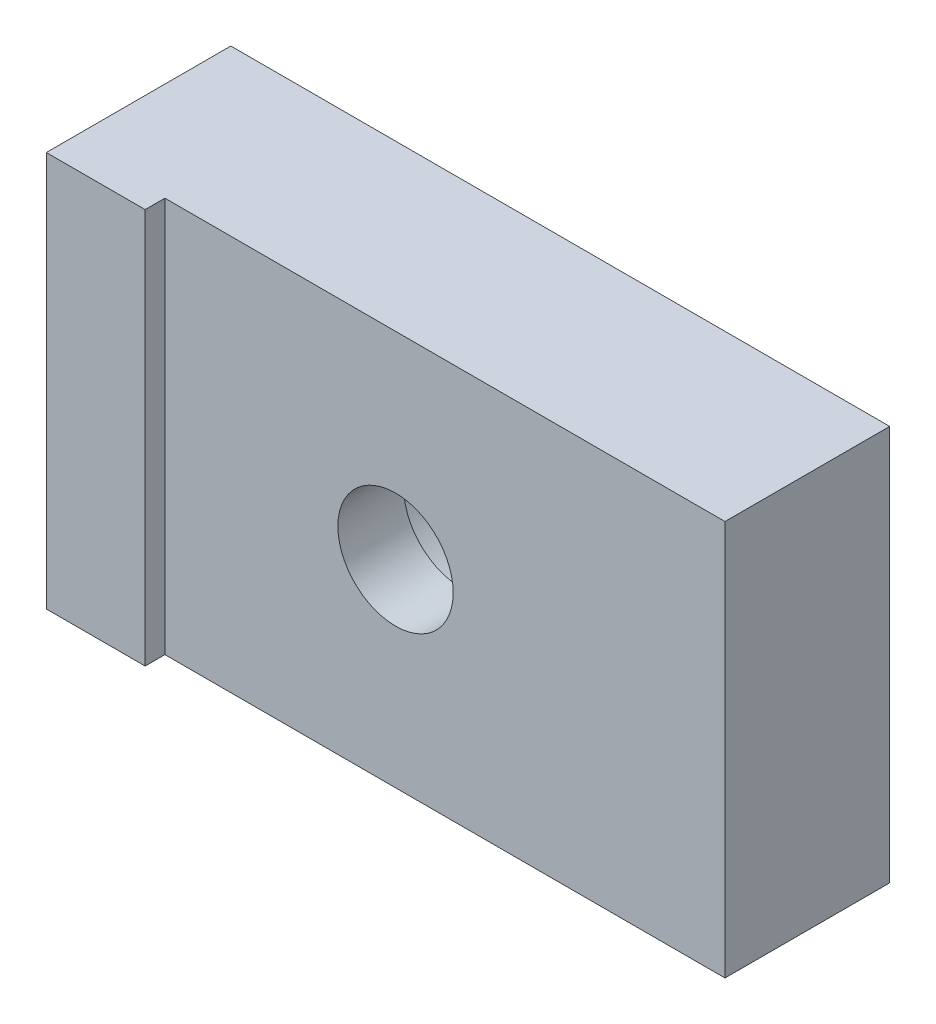
ISO-10303-21;
HEADER;
FILE_DESCRIPTION(('STEP AP214'),'2;1');
FILE_NAME('part.step','',(''),(''),'','','');
FILE_SCHEMA(('AUTOMOTIVE_DESIGN { 1 0 10303 214 1 1 1 1 }'));
ENDSEC;
DATA;
#1=APPLICATION_CONTEXT('core data for automotive mechanical design processes');
#2=APPLICATION_PROTOCOL_DEFINITION('international standard','automotive_design',2000,#1);
#3=PRODUCT_CONTEXT('',#1,'mechanical');
#4=PRODUCT('Part','Part','',(#3));
#5=PRODUCT_RELATED_PRODUCT_CATEGORY('part','',(#4));
#6=PRODUCT_DEFINITION_FORMATION('','',#4);
#7=PRODUCT_DEFINITION_CONTEXT('part definition',#1,'design');
#8=PRODUCT_DEFINITION('design','',#6,#7);
#9=PRODUCT_DEFINITION_SHAPE('','',#8);
#10=(LENGTH_UNIT() NAMED_UNIT(*) SI_UNIT(.MILLI.,.METRE.));
#11=(NAMED_UNIT(*) PLANE_ANGLE_UNIT() SI_UNIT($,.RADIAN.));
#12=(NAMED_UNIT(*) SI_UNIT($,.STERADIAN.) SOLID_ANGLE_UNIT());
#13=UNCERTAINTY_MEASURE_WITH_UNIT(LENGTH_MEASURE(1.E-05),#10,'distance_accuracy_value','');
#14=(GEOMETRIC_REPRESENTATION_CONTEXT(3) GLOBAL_UNCERTAINTY_ASSIGNED_CONTEXT((#13)) GLOBAL_UNIT_ASSIGNED_CONTEXT((#10,
#11,#12)) REPRESENTATION_CONTEXT('',''));
#15=CARTESIAN_POINT('',(0.,0.,0.));
#16=DIRECTION('',(0.,0.,1.));
#17=DIRECTION('',(1.,0.,0.));
#18=AXIS2_PLACEMENT_3D('',#15,#16,#17);
#19=CARTESIAN_POINT('',(10.,6.,5.));
#20=DIRECTION('',(0.,0.,-1.));
#21=DIRECTION('',(-1.,0.,0.));
#22=AXIS2_PLACEMENT_3D('',#19,#20,#21);
#23=CYLINDRICAL_SURFACE('',#22,1.75);
#24=CARTESIAN_POINT('',(10.,6.,5.));
#25=DIRECTION('',(0.,0.,1.));
#26=DIRECTION('',(1.,0.,0.));
#27=AXIS2_PLACEMENT_3D('',#24,#25,#26);
#28=CIRCLE('',#27,1.75);
#29=CARTESIAN_POINT('',(11.75,6.,5.));
#30=VERTEX_POINT('',#29);
#31=EDGE_CURVE('E100',#30,#30,#28,.T.);
#32=ORIENTED_EDGE('',*,*,#31,.T.);
#33=EDGE_LOOP('',(#32));
#34=FACE_BOUND('',#33,.T.);
#35=CARTESIAN_POINT('',(10.,6.,3.));
#36=DIRECTION('',(0.,0.,-1.));
#37=DIRECTION('',(-1.,0.,0.));
#38=AXIS2_PLACEMENT_3D('',#35,#36,#37);
#39=CIRCLE('',#38,1.75);
#40=CARTESIAN_POINT('',(8.25,6.,3.));
#41=VERTEX_POINT('',#40);
#42=EDGE_CURVE('E37',#41,#41,#39,.T.);
#43=ORIENTED_EDGE('',*,*,#42,.T.);
#44=EDGE_LOOP('',(#43));
#45=FACE_BOUND('',#44,.T.);
#46=ADVANCED_FACE('F33',(#34,#45),#23,.F.);
#47=CARTESIAN_POINT('',(0.,0.,5.));
#48=DIRECTION('',(0.,0.,-1.));
#49=DIRECTION('',(-1.,0.,0.));
#50=AXIS2_PLACEMENT_3D('',#47,#48,#49);
#51=PLANE('',#50);
#52=ORIENTED_EDGE('',*,*,#31,.F.);
#53=EDGE_LOOP('',(#52));
#54=FACE_BOUND('',#53,.T.);
#55=DIRECTION('',(0.,1.,0.));
#56=VECTOR('',#55,1.);
#57=CARTESIAN_POINT('',(3.,12.,5.));
#58=LINE('',#57,#56);
#59=CARTESIAN_POINT('',(3.,0.,5.));
#60=VERTEX_POINT('',#59);
#61=CARTESIAN_POINT('',(3.,12.,5.));
#62=VERTEX_POINT('',#61);
#63=EDGE_CURVE('E49',#60,#62,#58,.T.);
#64=ORIENTED_EDGE('',*,*,#63,.F.);
#65=DIRECTION('',(1.,0.,0.));
#66=VECTOR('',#65,1.);
#67=CARTESIAN_POINT('',(0.,0.,5.));
#68=LINE('',#67,#66);
#69=CARTESIAN_POINT('',(20.,0.,5.));
#70=VERTEX_POINT('',#69);
#71=EDGE_CURVE('E86',#60,#70,#68,.T.);
#72=ORIENTED_EDGE('',*,*,#71,.T.);
#73=DIRECTION('',(0.,1.,0.));
#74=VECTOR('',#73,1.);
#75=CARTESIAN_POINT('',(20.,0.,5.));
#76=LINE('',#75,#74);
#77=CARTESIAN_POINT('',(20.,12.,5.));
#78=VERTEX_POINT('',#77);
#79=EDGE_CURVE('E55',#70,#78,#76,.T.);
#80=ORIENTED_EDGE('',*,*,#79,.T.);
#81=DIRECTION('',(-1.,0.,0.));
#82=VECTOR('',#81,1.);
#83=CARTESIAN_POINT('',(0.,12.,5.));
#84=LINE('',#83,#82);
#85=EDGE_CURVE('E96',#78,#62,#84,.T.);
#86=ORIENTED_EDGE('',*,*,#85,.T.);
#87=EDGE_LOOP('',(#64,#72,#80,#86));
#88=FACE_BOUND('',#87,.T.);
#89=ADVANCED_FACE('F148',(#54,#88),#51,.F.);
#90=CARTESIAN_POINT('',(0.,0.,0.));
#91=DIRECTION('',(0.,0.,-1.));
#92=DIRECTION('',(-1.,0.,0.));
#93=AXIS2_PLACEMENT_3D('',#90,#91,#92);
#94=PLANE('',#93);
#95=CARTESIAN_POINT('',(10.,6.,0.));
#96=DIRECTION('',(0.,0.,-1.));
#97=DIRECTION('',(-1.,0.,0.));
#98=AXIS2_PLACEMENT_3D('',#95,#96,#97);
#99=CIRCLE('',#98,3.);
#100=CARTESIAN_POINT('',(7.,6.,0.));
#101=VERTEX_POINT('',#100);
#102=EDGE_CURVE('E258',#101,#101,#99,.T.);
#103=ORIENTED_EDGE('',*,*,#102,.F.);
#104=EDGE_LOOP('',(#103));
#105=FACE_BOUND('',#104,.T.);
#106=DIRECTION('',(0.,-1.,0.));
#107=VECTOR('',#106,1.);
#108=CARTESIAN_POINT('',(0.,0.,0.));
#109=LINE('',#108,#107);
#110=CARTESIAN_POINT('',(0.,12.,0.));
#111=VERTEX_POINT('',#110);
#112=CARTESIAN_POINT('',(0.,0.,0.));
#113=VERTEX_POINT('',#112);
#114=EDGE_CURVE('E93',#111,#113,#109,.T.);
#115=ORIENTED_EDGE('',*,*,#114,.F.);
#116=DIRECTION('',(-1.,0.,0.));
#117=VECTOR('',#116,1.);
#118=CARTESIAN_POINT('',(0.,12.,0.));
#119=LINE('',#118,#117);
#120=CARTESIAN_POINT('',(20.,12.,0.));
#121=VERTEX_POINT('',#120);
#122=EDGE_CURVE('E75',#121,#111,#119,.T.);
#123=ORIENTED_EDGE('',*,*,#122,.F.);
#124=DIRECTION('',(0.,1.,0.));
#125=VECTOR('',#124,1.);
#126=CARTESIAN_POINT('',(20.,0.,0.));
#127=LINE('',#126,#125);
#128=CARTESIAN_POINT('',(20.,0.,0.));
#129=VERTEX_POINT('',#128);
#130=EDGE_CURVE('E87',#129,#121,#127,.T.);
#131=ORIENTED_EDGE('',*,*,#130,.F.);
#132=DIRECTION('',(1.,0.,0.));
#133=VECTOR('',#132,1.);
#134=CARTESIAN_POINT('',(0.,0.,0.));
#135=LINE('',#134,#133);
#136=EDGE_CURVE('E99',#113,#129,#135,.T.);
#137=ORIENTED_EDGE('',*,*,#136,.F.);
#138=EDGE_LOOP('',(#115,#123,#131,#137));
#139=FACE_BOUND('',#138,.T.);
#140=ADVANCED_FACE('F98',(#105,#139),#94,.T.);
#141=CARTESIAN_POINT('',(0.,0.,5.));
#142=DIRECTION('',(1.,0.,0.));
#143=DIRECTION('',(0.,0.,-1.));
#144=AXIS2_PLACEMENT_3D('',#141,#142,#143);
#145=PLANE('',#144);
#146=ORIENTED_EDGE('',*,*,#114,.T.);
#147=DIRECTION('',(0.,0.,-1.));
#148=VECTOR('',#147,1.);
#149=CARTESIAN_POINT('',(0.,0.,5.));
#150=LINE('',#149,#148);
#151=CARTESIAN_POINT('',(0.,0.,5.6));
#152=VERTEX_POINT('',#151);
#153=EDGE_CURVE('E11',#152,#113,#150,.T.);
#154=ORIENTED_EDGE('',*,*,#153,.F.);
#155=DIRECTION('',(0.,-1.,0.));
#156=VECTOR('',#155,1.);
#157=CARTESIAN_POINT('',(0.,12.,5.6));
#158=LINE('',#157,#156);
#159=CARTESIAN_POINT('',(0.,12.,5.6));
#160=VERTEX_POINT('',#159);
#161=EDGE_CURVE('E95',#160,#152,#158,.T.);
#162=ORIENTED_EDGE('',*,*,#161,.F.);
#163=DIRECTION('',(0.,0.,-1.));
#164=VECTOR('',#163,1.);
#165=CARTESIAN_POINT('',(0.,12.,5.));
#166=LINE('',#165,#164);
#167=EDGE_CURVE('E79',#160,#111,#166,.T.);
#168=ORIENTED_EDGE('',*,*,#167,.T.);
#169=EDGE_LOOP('',(#146,#154,#162,#168));
#170=FACE_BOUND('',#169,.T.);
#171=ADVANCED_FACE('F35',(#170),#145,.F.);
#172=CARTESIAN_POINT('',(0.,0.,5.));
#173=DIRECTION('',(0.,1.,0.));
#174=DIRECTION('',(0.,0.,1.));
#175=AXIS2_PLACEMENT_3D('',#172,#173,#174);
#176=PLANE('',#175);
#177=ORIENTED_EDGE('',*,*,#136,.T.);
#178=DIRECTION('',(0.,0.,-1.));
#179=VECTOR('',#178,1.);
#180=CARTESIAN_POINT('',(20.,0.,5.));
#181=LINE('',#180,#179);
#182=EDGE_CURVE('E42',#70,#129,#181,.T.);
#183=ORIENTED_EDGE('',*,*,#182,.F.);
#184=ORIENTED_EDGE('',*,*,#71,.F.);
#185=DIRECTION('',(0.,0.,-1.));
#186=VECTOR('',#185,1.);
#187=CARTESIAN_POINT('',(3.,0.,5.6));
#188=LINE('',#187,#186);
#189=CARTESIAN_POINT('',(3.,0.,5.6));
#190=VERTEX_POINT('',#189);
#191=EDGE_CURVE('E104',#190,#60,#188,.T.);
#192=ORIENTED_EDGE('',*,*,#191,.F.);
#193=DIRECTION('',(1.,0.,0.));
#194=VECTOR('',#193,1.);
#195=CARTESIAN_POINT('',(0.,0.,5.6));
#196=LINE('',#195,#194);
#197=EDGE_CURVE('E122',#152,#190,#196,.T.);
#198=ORIENTED_EDGE('',*,*,#197,.F.);
#199=ORIENTED_EDGE('',*,*,#153,.T.);
#200=EDGE_LOOP('',(#177,#183,#184,#192,#198,#199));
#201=FACE_BOUND('',#200,.T.);
#202=ADVANCED_FACE('F116',(#201),#176,.F.);
#203=CARTESIAN_POINT('',(20.,0.,5.));
#204=DIRECTION('',(-1.,0.,0.));
#205=DIRECTION('',(0.,0.,1.));
#206=AXIS2_PLACEMENT_3D('',#203,#204,#205);
#207=PLANE('',#206);
#208=ORIENTED_EDGE('',*,*,#130,.T.);
#209=DIRECTION('',(0.,0.,-1.));
#210=VECTOR('',#209,1.);
#211=CARTESIAN_POINT('',(20.,12.,5.));
#212=LINE('',#211,#210);
#213=EDGE_CURVE('E82',#78,#121,#212,.T.);
#214=ORIENTED_EDGE('',*,*,#213,.F.);
#215=ORIENTED_EDGE('',*,*,#79,.F.);
#216=ORIENTED_EDGE('',*,*,#182,.T.);
#217=EDGE_LOOP('',(#208,#214,#215,#216));
#218=FACE_BOUND('',#217,.T.);
#219=ADVANCED_FACE('F114',(#218),#207,.F.);
#220=CARTESIAN_POINT('',(0.,12.,5.));
#221=DIRECTION('',(0.,-1.,0.));
#222=DIRECTION('',(0.,0.,-1.));
#223=AXIS2_PLACEMENT_3D('',#220,#221,#222);
#224=PLANE('',#223);
#225=ORIENTED_EDGE('',*,*,#122,.T.);
#226=ORIENTED_EDGE('',*,*,#167,.F.);
#227=DIRECTION('',(-1.,0.,0.));
#228=VECTOR('',#227,1.);
#229=CARTESIAN_POINT('',(0.,12.,5.6));
#230=LINE('',#229,#228);
#231=CARTESIAN_POINT('',(3.,12.,5.6));
#232=VERTEX_POINT('',#231);
#233=EDGE_CURVE('E136',#232,#160,#230,.T.);
#234=ORIENTED_EDGE('',*,*,#233,.F.);
#235=DIRECTION('',(0.,0.,-1.));
#236=VECTOR('',#235,1.);
#237=CARTESIAN_POINT('',(3.,12.,5.6));
#238=LINE('',#237,#236);
#239=EDGE_CURVE('E140',#232,#62,#238,.T.);
#240=ORIENTED_EDGE('',*,*,#239,.T.);
#241=ORIENTED_EDGE('',*,*,#85,.F.);
#242=ORIENTED_EDGE('',*,*,#213,.T.);
#243=EDGE_LOOP('',(#225,#226,#234,#240,#241,#242));
#244=FACE_BOUND('',#243,.T.);
#245=ADVANCED_FACE('F77',(#244),#224,.F.);
#246=CARTESIAN_POINT('',(3.,12.,5.6));
#247=DIRECTION('',(-1.,0.,0.));
#248=DIRECTION('',(0.,-1.,0.));
#249=AXIS2_PLACEMENT_3D('',#246,#247,#248);
#250=PLANE('',#249);
#251=ORIENTED_EDGE('',*,*,#63,.T.);
#252=ORIENTED_EDGE('',*,*,#239,.F.);
#253=DIRECTION('',(0.,1.,0.));
#254=VECTOR('',#253,1.);
#255=CARTESIAN_POINT('',(3.,12.,5.6));
#256=LINE('',#255,#254);
#257=EDGE_CURVE('E133',#190,#232,#256,.T.);
#258=ORIENTED_EDGE('',*,*,#257,.F.);
#259=ORIENTED_EDGE('',*,*,#191,.T.);
#260=EDGE_LOOP('',(#251,#252,#258,#259));
#261=FACE_BOUND('',#260,.T.);
#262=ADVANCED_FACE('F141',(#261),#250,.F.);
#263=CARTESIAN_POINT('',(0.,0.,5.6));
#264=DIRECTION('',(0.,0.,1.));
#265=DIRECTION('',(1.,0.,0.));
#266=AXIS2_PLACEMENT_3D('',#263,#264,#265);
#267=PLANE('',#266);
#268=ORIENTED_EDGE('',*,*,#161,.T.);
#269=ORIENTED_EDGE('',*,*,#197,.T.);
#270=ORIENTED_EDGE('',*,*,#257,.T.);
#271=ORIENTED_EDGE('',*,*,#233,.T.);
#272=EDGE_LOOP('',(#268,#269,#270,#271));
#273=FACE_BOUND('',#272,.T.);
#274=ADVANCED_FACE('F135',(#273),#267,.T.);
#275=CARTESIAN_POINT('',(10.,6.,3.));
#276=DIRECTION('',(0.,0.,-1.));
#277=DIRECTION('',(-1.,0.,0.));
#278=AXIS2_PLACEMENT_3D('',#275,#276,#277);
#279=CYLINDRICAL_SURFACE('',#278,3.);
#280=CARTESIAN_POINT('',(10.,6.,3.));
#281=DIRECTION('',(0.,0.,-1.));
#282=DIRECTION('',(-1.,0.,0.));
#283=AXIS2_PLACEMENT_3D('',#280,#281,#282);
#284=CIRCLE('',#283,3.);
#285=CARTESIAN_POINT('',(7.,6.,3.));
#286=VERTEX_POINT('',#285);
#287=EDGE_CURVE('E257',#286,#286,#284,.T.);
#288=ORIENTED_EDGE('',*,*,#287,.F.);
#289=EDGE_LOOP('',(#288));
#290=FACE_BOUND('',#289,.T.);
#291=ORIENTED_EDGE('',*,*,#102,.T.);
#292=EDGE_LOOP('',(#291));
#293=FACE_BOUND('',#292,.T.);
#294=ADVANCED_FACE('F185',(#290,#293),#279,.F.);
#295=CARTESIAN_POINT('',(10.,6.,3.));
#296=DIRECTION('',(0.,0.,-1.));
#297=DIRECTION('',(-1.,0.,0.));
#298=AXIS2_PLACEMENT_3D('',#295,#296,#297);
#299=PLANE('',#298);
#300=ORIENTED_EDGE('',*,*,#42,.F.);
#301=EDGE_LOOP('',(#300));
#302=FACE_BOUND('',#301,.T.);
#303=ORIENTED_EDGE('',*,*,#287,.T.);
#304=EDGE_LOOP('',(#303));
#305=FACE_BOUND('',#304,.T.);
#306=ADVANCED_FACE('F190',(#302,#305),#299,.T.);
#307=CLOSED_SHELL('',(#46,#89,#140,#171,#202,#219,#245,#262,#274,#294,#306));
#308=MANIFOLD_SOLID_BREP('B2',#307);
#309=ADVANCED_BREP_SHAPE_REPRESENTATION('',(#18,#308),#14);
#310=SHAPE_DEFINITION_REPRESENTATION(#9,#309);
ENDSEC;
END-ISO-10303-21;
